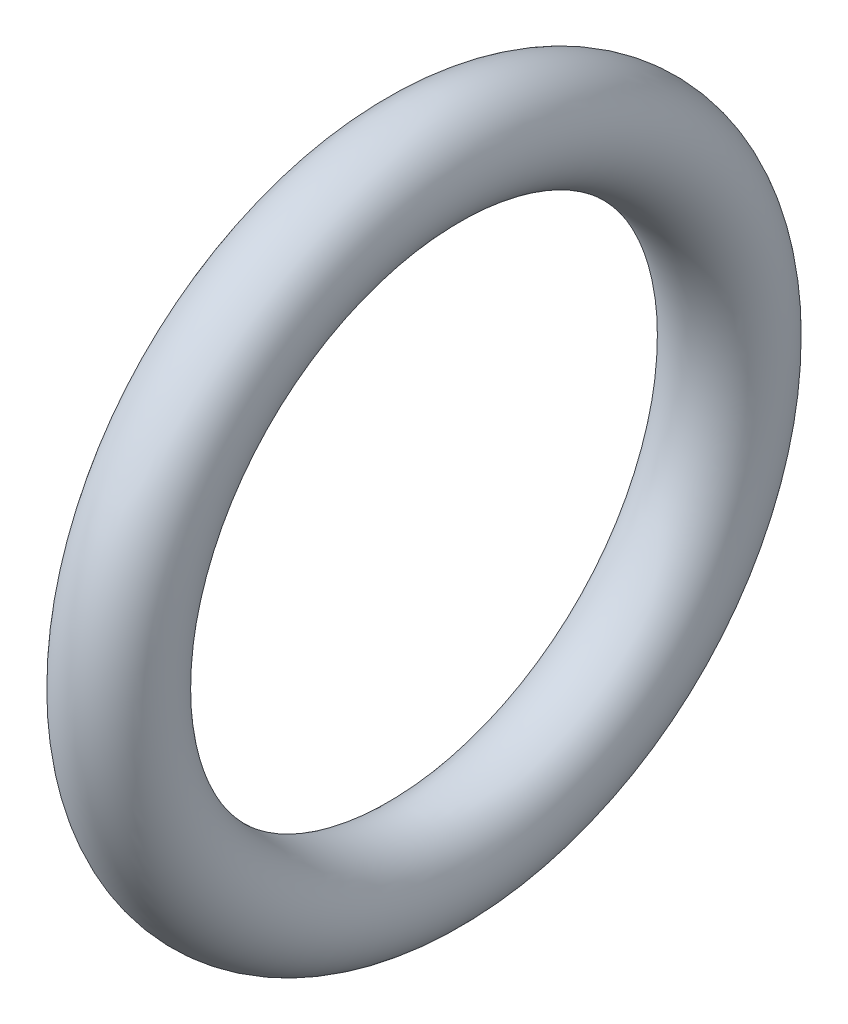
ISO-10303-21;
HEADER;
FILE_DESCRIPTION(('STEP AP214'),'2;1');
FILE_NAME('part.step','',(''),(''),'','','');
FILE_SCHEMA(('AUTOMOTIVE_DESIGN { 1 0 10303 214 1 1 1 1 }'));
ENDSEC;
DATA;
#1=APPLICATION_CONTEXT('core data for automotive mechanical design processes');
#2=APPLICATION_PROTOCOL_DEFINITION('international standard','automotive_design',2000,#1);
#3=PRODUCT_CONTEXT('',#1,'mechanical');
#4=PRODUCT('Part','Part','',(#3));
#5=PRODUCT_RELATED_PRODUCT_CATEGORY('part','',(#4));
#6=PRODUCT_DEFINITION_FORMATION('','',#4);
#7=PRODUCT_DEFINITION_CONTEXT('part definition',#1,'design');
#8=PRODUCT_DEFINITION('design','',#6,#7);
#9=PRODUCT_DEFINITION_SHAPE('','',#8);
#10=(LENGTH_UNIT() NAMED_UNIT(*) SI_UNIT(.MILLI.,.METRE.));
#11=(NAMED_UNIT(*) PLANE_ANGLE_UNIT() SI_UNIT($,.RADIAN.));
#12=(NAMED_UNIT(*) SI_UNIT($,.STERADIAN.) SOLID_ANGLE_UNIT());
#13=UNCERTAINTY_MEASURE_WITH_UNIT(LENGTH_MEASURE(1.E-05),#10,'distance_accuracy_value','');
#14=(GEOMETRIC_REPRESENTATION_CONTEXT(3) GLOBAL_UNCERTAINTY_ASSIGNED_CONTEXT((#13)) GLOBAL_UNIT_ASSIGNED_CONTEXT((#10,
#11,#12)) REPRESENTATION_CONTEXT('',''));
#15=CARTESIAN_POINT('',(0.,0.,0.));
#16=DIRECTION('',(0.,0.,1.));
#17=DIRECTION('',(1.,0.,0.));
#18=AXIS2_PLACEMENT_3D('',#15,#16,#17);
#19=CARTESIAN_POINT('',(0.,0.,0.));
#20=DIRECTION('',(-1.,0.,0.));
#21=DIRECTION('',(0.,0.,1.));
#22=AXIS2_PLACEMENT_3D('',#19,#20,#21);
#23=TOROIDAL_SURFACE('',#22,9.,1.5);
#24=CARTESIAN_POINT('',(0.,0.,10.5));
#25=VERTEX_POINT('',#24);
#26=VERTEX_LOOP('',#25);
#27=FACE_BOUND('',#26,.T.);
#28=ADVANCED_FACE('F45',(#27),#23,.T.);
#29=CLOSED_SHELL('',(#28));
#30=MANIFOLD_SOLID_BREP('B2',#29);
#31=ADVANCED_BREP_SHAPE_REPRESENTATION('',(#18,#30),#14);
#32=SHAPE_DEFINITION_REPRESENTATION(#9,#31);
ENDSEC;
END-ISO-10303-21;
